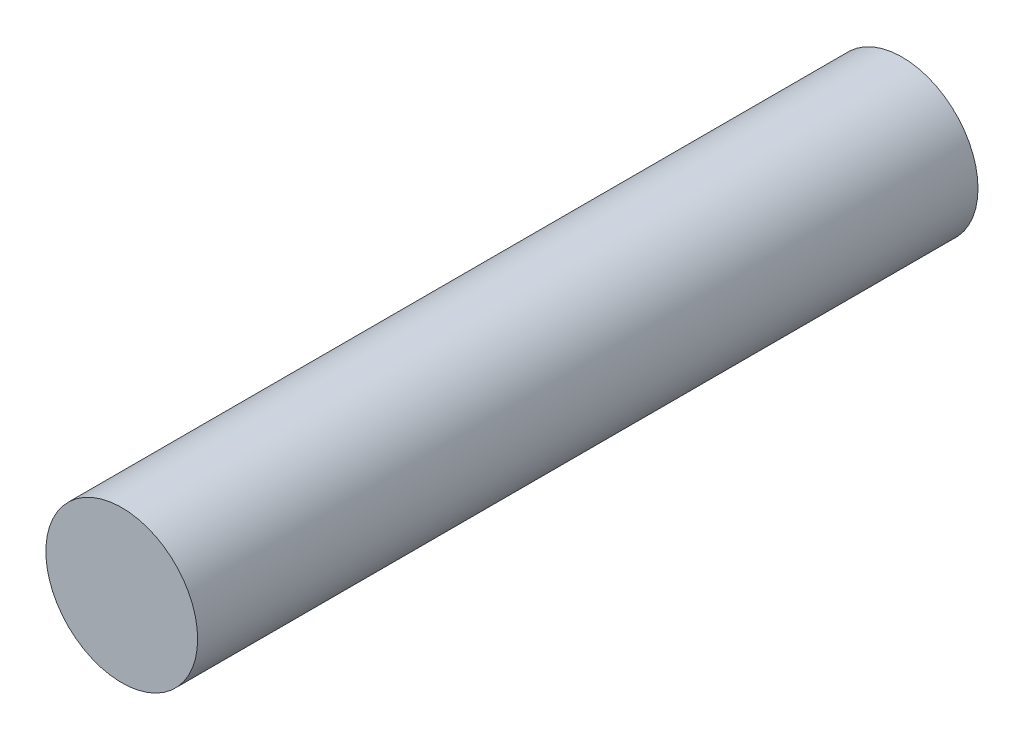
ISO-10303-21;
HEADER;
FILE_DESCRIPTION(('STEP AP214'),'2;1');
FILE_NAME('part.step','',(''),(''),'','','');
FILE_SCHEMA(('AUTOMOTIVE_DESIGN { 1 0 10303 214 1 1 1 1 }'));
ENDSEC;
DATA;
#1=APPLICATION_CONTEXT('core data for automotive mechanical design processes');
#2=APPLICATION_PROTOCOL_DEFINITION('international standard','automotive_design',2000,#1);
#3=PRODUCT_CONTEXT('',#1,'mechanical');
#4=PRODUCT('Part','Part','',(#3));
#5=PRODUCT_RELATED_PRODUCT_CATEGORY('part','',(#4));
#6=PRODUCT_DEFINITION_FORMATION('','',#4);
#7=PRODUCT_DEFINITION_CONTEXT('part definition',#1,'design');
#8=PRODUCT_DEFINITION('design','',#6,#7);
#9=PRODUCT_DEFINITION_SHAPE('','',#8);
#10=(LENGTH_UNIT() NAMED_UNIT(*) SI_UNIT(.MILLI.,.METRE.));
#11=(NAMED_UNIT(*) PLANE_ANGLE_UNIT() SI_UNIT($,.RADIAN.));
#12=(NAMED_UNIT(*) SI_UNIT($,.STERADIAN.) SOLID_ANGLE_UNIT());
#13=UNCERTAINTY_MEASURE_WITH_UNIT(LENGTH_MEASURE(1.E-05),#10,'distance_accuracy_value','');
#14=(GEOMETRIC_REPRESENTATION_CONTEXT(3) GLOBAL_UNCERTAINTY_ASSIGNED_CONTEXT((#13)) GLOBAL_UNIT_ASSIGNED_CONTEXT((#10,
#11,#12)) REPRESENTATION_CONTEXT('',''));
#15=CARTESIAN_POINT('',(0.,0.,0.));
#16=DIRECTION('',(0.,0.,1.));
#17=DIRECTION('',(1.,0.,0.));
#18=AXIS2_PLACEMENT_3D('',#15,#16,#17);
#19=CARTESIAN_POINT('',(0.,0.,508.));
#20=DIRECTION('',(0.,0.,-1.));
#21=DIRECTION('',(-1.,0.,0.));
#22=AXIS2_PLACEMENT_3D('',#19,#20,#21);
#23=CYLINDRICAL_SURFACE('',#22,49.403);
#24=CARTESIAN_POINT('',(0.,0.,508.));
#25=DIRECTION('',(0.,0.,1.));
#26=DIRECTION('',(1.,0.,0.));
#27=AXIS2_PLACEMENT_3D('',#24,#25,#26);
#28=CIRCLE('',#27,49.403);
#29=CARTESIAN_POINT('',(49.403,0.,508.));
#30=VERTEX_POINT('',#29);
#31=EDGE_CURVE('E10',#30,#30,#28,.T.);
#32=ORIENTED_EDGE('',*,*,#31,.F.);
#33=EDGE_LOOP('',(#32));
#34=FACE_BOUND('',#33,.T.);
#35=CARTESIAN_POINT('',(0.,0.,0.));
#36=DIRECTION('',(0.,0.,1.));
#37=DIRECTION('',(1.,0.,0.));
#38=AXIS2_PLACEMENT_3D('',#35,#36,#37);
#39=CIRCLE('',#38,49.403);
#40=CARTESIAN_POINT('',(49.403,0.,0.));
#41=VERTEX_POINT('',#40);
#42=EDGE_CURVE('E34',#41,#41,#39,.T.);
#43=ORIENTED_EDGE('',*,*,#42,.T.);
#44=EDGE_LOOP('',(#43));
#45=FACE_BOUND('',#44,.T.);
#46=ADVANCED_FACE('F31',(#34,#45),#23,.T.);
#47=CARTESIAN_POINT('',(0.,0.,508.));
#48=DIRECTION('',(0.,0.,1.));
#49=DIRECTION('',(1.,0.,0.));
#50=AXIS2_PLACEMENT_3D('',#47,#48,#49);
#51=PLANE('',#50);
#52=ORIENTED_EDGE('',*,*,#31,.T.);
#53=EDGE_LOOP('',(#52));
#54=FACE_BOUND('',#53,.T.);
#55=ADVANCED_FACE('F46',(#54),#51,.T.);
#56=CARTESIAN_POINT('',(0.,0.,0.));
#57=DIRECTION('',(0.,0.,1.));
#58=DIRECTION('',(1.,0.,0.));
#59=AXIS2_PLACEMENT_3D('',#56,#57,#58);
#60=PLANE('',#59);
#61=ORIENTED_EDGE('',*,*,#42,.F.);
#62=EDGE_LOOP('',(#61));
#63=FACE_BOUND('',#62,.T.);
#64=ADVANCED_FACE('F44',(#63),#60,.F.);
#65=CLOSED_SHELL('',(#46,#55,#64));
#66=MANIFOLD_SOLID_BREP('B2',#65);
#67=ADVANCED_BREP_SHAPE_REPRESENTATION('',(#18,#66),#14);
#68=SHAPE_DEFINITION_REPRESENTATION(#9,#67);
ENDSEC;
END-ISO-10303-21;
